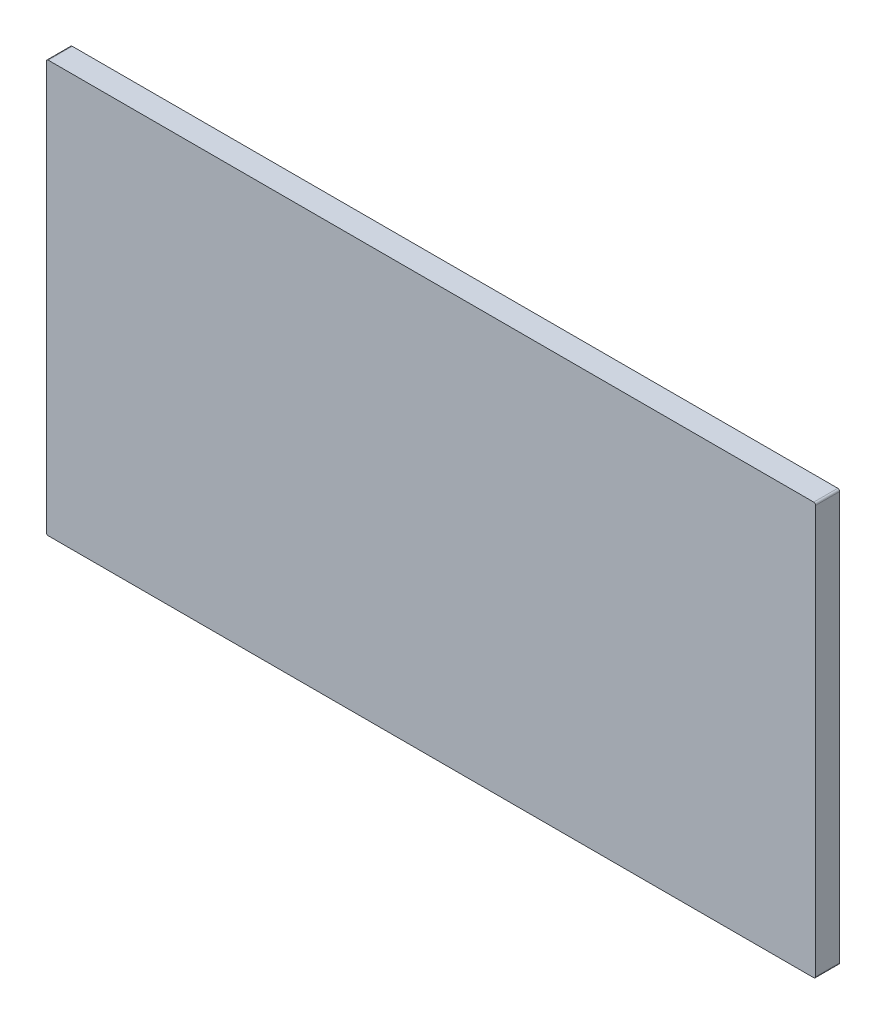
ISO-10303-21;
HEADER;
FILE_DESCRIPTION(('STEP AP214'),'2;1');
FILE_NAME('part.step','',(''),(''),'','','');
FILE_SCHEMA(('AUTOMOTIVE_DESIGN { 1 0 10303 214 1 1 1 1 }'));
ENDSEC;
DATA;
#1=APPLICATION_CONTEXT('core data for automotive mechanical design processes');
#2=APPLICATION_PROTOCOL_DEFINITION('international standard','automotive_design',2000,#1);
#3=PRODUCT_CONTEXT('',#1,'mechanical');
#4=PRODUCT('Part','Part','',(#3));
#5=PRODUCT_RELATED_PRODUCT_CATEGORY('part','',(#4));
#6=PRODUCT_DEFINITION_FORMATION('','',#4);
#7=PRODUCT_DEFINITION_CONTEXT('part definition',#1,'design');
#8=PRODUCT_DEFINITION('design','',#6,#7);
#9=PRODUCT_DEFINITION_SHAPE('','',#8);
#10=(LENGTH_UNIT() NAMED_UNIT(*) SI_UNIT(.MILLI.,.METRE.));
#11=(NAMED_UNIT(*) PLANE_ANGLE_UNIT() SI_UNIT($,.RADIAN.));
#12=(NAMED_UNIT(*) SI_UNIT($,.STERADIAN.) SOLID_ANGLE_UNIT());
#13=UNCERTAINTY_MEASURE_WITH_UNIT(LENGTH_MEASURE(1.E-05),#10,'distance_accuracy_value','');
#14=(GEOMETRIC_REPRESENTATION_CONTEXT(3) GLOBAL_UNCERTAINTY_ASSIGNED_CONTEXT((#13)) GLOBAL_UNIT_ASSIGNED_CONTEXT((#10,
#11,#12)) REPRESENTATION_CONTEXT('',''));
#15=CARTESIAN_POINT('',(0.,0.,0.));
#16=DIRECTION('',(0.,0.,1.));
#17=DIRECTION('',(1.,0.,0.));
#18=AXIS2_PLACEMENT_3D('',#15,#16,#17);
#19=CARTESIAN_POINT('',(-304.8,-163.195,9.525));
#20=DIRECTION('',(1.,0.,0.));
#21=DIRECTION('',(0.,0.,-1.));
#22=AXIS2_PLACEMENT_3D('',#19,#20,#21);
#23=PLANE('',#22);
#24=DIRECTION('',(0.,-1.,0.));
#25=VECTOR('',#24,1.);
#26=CARTESIAN_POINT('',(-304.8,-163.195,-9.525));
#27=LINE('',#26,#25);
#28=CARTESIAN_POINT('',(-304.8,161.695,-9.525));
#29=VERTEX_POINT('',#28);
#30=CARTESIAN_POINT('',(-304.8,-161.695,-9.525));
#31=VERTEX_POINT('',#30);
#32=EDGE_CURVE('E126',#29,#31,#27,.T.);
#33=ORIENTED_EDGE('',*,*,#32,.T.);
#34=DIRECTION('',(0.,0.,-1.));
#35=VECTOR('',#34,1.);
#36=CARTESIAN_POINT('',(-304.8,-161.695,9.525));
#37=LINE('',#36,#35);
#38=CARTESIAN_POINT('',(-304.8,-161.695,9.525));
#39=VERTEX_POINT('',#38);
#40=EDGE_CURVE('E104',#31,#39,#37,.F.);
#41=ORIENTED_EDGE('',*,*,#40,.T.);
#42=DIRECTION('',(0.,-1.,0.));
#43=VECTOR('',#42,1.);
#44=CARTESIAN_POINT('',(-304.8,-163.195,9.525));
#45=LINE('',#44,#43);
#46=CARTESIAN_POINT('',(-304.8,161.695,9.525));
#47=VERTEX_POINT('',#46);
#48=EDGE_CURVE('E135',#47,#39,#45,.T.);
#49=ORIENTED_EDGE('',*,*,#48,.F.);
#50=DIRECTION('',(0.,0.,-1.));
#51=VECTOR('',#50,1.);
#52=CARTESIAN_POINT('',(-304.8,161.695,9.525));
#53=LINE('',#52,#51);
#54=EDGE_CURVE('E109',#47,#29,#53,.T.);
#55=ORIENTED_EDGE('',*,*,#54,.T.);
#56=EDGE_LOOP('',(#33,#41,#49,#55));
#57=FACE_BOUND('',#56,.T.);
#58=ADVANCED_FACE('F33',(#57),#23,.F.);
#59=CARTESIAN_POINT('',(304.8,-163.195,9.525));
#60=DIRECTION('',(0.,1.,0.));
#61=DIRECTION('',(-1.,0.,0.));
#62=AXIS2_PLACEMENT_3D('',#59,#60,#61);
#63=PLANE('',#62);
#64=DIRECTION('',(1.,0.,0.));
#65=VECTOR('',#64,1.);
#66=CARTESIAN_POINT('',(304.8,-163.195,9.525));
#67=LINE('',#66,#65);
#68=CARTESIAN_POINT('',(-303.3,-163.195,9.525));
#69=VERTEX_POINT('',#68);
#70=CARTESIAN_POINT('',(303.3,-163.195,9.525));
#71=VERTEX_POINT('',#70);
#72=EDGE_CURVE('E119',#69,#71,#67,.T.);
#73=ORIENTED_EDGE('',*,*,#72,.F.);
#74=DIRECTION('',(0.,0.,-1.));
#75=VECTOR('',#74,1.);
#76=CARTESIAN_POINT('',(-303.3,-163.195,9.525));
#77=LINE('',#76,#75);
#78=CARTESIAN_POINT('',(-303.3,-163.195,-9.525));
#79=VERTEX_POINT('',#78);
#80=EDGE_CURVE('E103',#69,#79,#77,.T.);
#81=ORIENTED_EDGE('',*,*,#80,.T.);
#82=DIRECTION('',(1.,0.,0.));
#83=VECTOR('',#82,1.);
#84=CARTESIAN_POINT('',(304.8,-163.195,-9.525));
#85=LINE('',#84,#83);
#86=CARTESIAN_POINT('',(303.3,-163.195,-9.525));
#87=VERTEX_POINT('',#86);
#88=EDGE_CURVE('E116',#79,#87,#85,.T.);
#89=ORIENTED_EDGE('',*,*,#88,.T.);
#90=DIRECTION('',(0.,0.,-1.));
#91=VECTOR('',#90,1.);
#92=CARTESIAN_POINT('',(303.3,-163.195,9.525));
#93=LINE('',#92,#91);
#94=EDGE_CURVE('E121',#87,#71,#93,.F.);
#95=ORIENTED_EDGE('',*,*,#94,.T.);
#96=EDGE_LOOP('',(#73,#81,#89,#95));
#97=FACE_BOUND('',#96,.T.);
#98=ADVANCED_FACE('F115',(#97),#63,.F.);
#99=CARTESIAN_POINT('',(304.8,-163.195,9.525));
#100=DIRECTION('',(-1.,0.,0.));
#101=DIRECTION('',(0.,0.,1.));
#102=AXIS2_PLACEMENT_3D('',#99,#100,#101);
#103=PLANE('',#102);
#104=DIRECTION('',(0.,1.,0.));
#105=VECTOR('',#104,1.);
#106=CARTESIAN_POINT('',(304.8,-163.195,9.525));
#107=LINE('',#106,#105);
#108=CARTESIAN_POINT('',(304.8,-161.695,9.525));
#109=VERTEX_POINT('',#108);
#110=CARTESIAN_POINT('',(304.8,161.695,9.525));
#111=VERTEX_POINT('',#110);
#112=EDGE_CURVE('E161',#109,#111,#107,.T.);
#113=ORIENTED_EDGE('',*,*,#112,.F.);
#114=DIRECTION('',(0.,0.,-1.));
#115=VECTOR('',#114,1.);
#116=CARTESIAN_POINT('',(304.8,-161.695,9.525));
#117=LINE('',#116,#115);
#118=CARTESIAN_POINT('',(304.8,-161.695,-9.525));
#119=VERTEX_POINT('',#118);
#120=EDGE_CURVE('E154',#109,#119,#117,.T.);
#121=ORIENTED_EDGE('',*,*,#120,.T.);
#122=DIRECTION('',(0.,1.,0.));
#123=VECTOR('',#122,1.);
#124=CARTESIAN_POINT('',(304.8,-163.195,-9.525));
#125=LINE('',#124,#123);
#126=CARTESIAN_POINT('',(304.8,161.695,-9.525));
#127=VERTEX_POINT('',#126);
#128=EDGE_CURVE('E125',#119,#127,#125,.T.);
#129=ORIENTED_EDGE('',*,*,#128,.T.);
#130=DIRECTION('',(0.,0.,-1.));
#131=VECTOR('',#130,1.);
#132=CARTESIAN_POINT('',(304.8,161.695,9.525));
#133=LINE('',#132,#131);
#134=EDGE_CURVE('E152',#127,#111,#133,.F.);
#135=ORIENTED_EDGE('',*,*,#134,.T.);
#136=EDGE_LOOP('',(#113,#121,#129,#135));
#137=FACE_BOUND('',#136,.T.);
#138=ADVANCED_FACE('F159',(#137),#103,.F.);
#139=CARTESIAN_POINT('',(304.8,163.195,9.525));
#140=DIRECTION('',(0.,-1.,0.));
#141=DIRECTION('',(1.,0.,0.));
#142=AXIS2_PLACEMENT_3D('',#139,#140,#141);
#143=PLANE('',#142);
#144=DIRECTION('',(-1.,0.,0.));
#145=VECTOR('',#144,1.);
#146=CARTESIAN_POINT('',(304.8,163.195,9.525));
#147=LINE('',#146,#145);
#148=CARTESIAN_POINT('',(303.3,163.195,9.525));
#149=VERTEX_POINT('',#148);
#150=CARTESIAN_POINT('',(-303.3,163.195,9.525));
#151=VERTEX_POINT('',#150);
#152=EDGE_CURVE('E136',#149,#151,#147,.T.);
#153=ORIENTED_EDGE('',*,*,#152,.F.);
#154=DIRECTION('',(0.,0.,-1.));
#155=VECTOR('',#154,1.);
#156=CARTESIAN_POINT('',(303.3,163.195,9.525));
#157=LINE('',#156,#155);
#158=CARTESIAN_POINT('',(303.3,163.195,-9.525));
#159=VERTEX_POINT('',#158);
#160=EDGE_CURVE('E11',#149,#159,#157,.T.);
#161=ORIENTED_EDGE('',*,*,#160,.T.);
#162=DIRECTION('',(-1.,0.,0.));
#163=VECTOR('',#162,1.);
#164=CARTESIAN_POINT('',(304.8,163.195,-9.525));
#165=LINE('',#164,#163);
#166=CARTESIAN_POINT('',(-303.3,163.195,-9.525));
#167=VERTEX_POINT('',#166);
#168=EDGE_CURVE('E129',#159,#167,#165,.T.);
#169=ORIENTED_EDGE('',*,*,#168,.T.);
#170=DIRECTION('',(0.,0.,-1.));
#171=VECTOR('',#170,1.);
#172=CARTESIAN_POINT('',(-303.3,163.195,9.525));
#173=LINE('',#172,#171);
#174=EDGE_CURVE('E41',#167,#151,#173,.F.);
#175=ORIENTED_EDGE('',*,*,#174,.T.);
#176=EDGE_LOOP('',(#153,#161,#169,#175));
#177=FACE_BOUND('',#176,.T.);
#178=ADVANCED_FACE('F168',(#177),#143,.F.);
#179=CARTESIAN_POINT('',(0.,0.,9.525));
#180=DIRECTION('',(0.,0.,1.));
#181=DIRECTION('',(1.,0.,0.));
#182=AXIS2_PLACEMENT_3D('',#179,#180,#181);
#183=PLANE('',#182);
#184=ORIENTED_EDGE('',*,*,#48,.T.);
#185=CARTESIAN_POINT('',(-303.3,-161.695,9.525));
#186=DIRECTION('',(0.,0.,1.));
#187=DIRECTION('',(1.,0.,0.));
#188=AXIS2_PLACEMENT_3D('',#185,#186,#187);
#189=CIRCLE('',#188,1.5);
#190=EDGE_CURVE('E150',#39,#69,#189,.T.);
#191=ORIENTED_EDGE('',*,*,#190,.T.);
#192=ORIENTED_EDGE('',*,*,#72,.T.);
#193=CARTESIAN_POINT('',(303.3,-161.695,9.525));
#194=DIRECTION('',(0.,0.,1.));
#195=DIRECTION('',(1.,0.,0.));
#196=AXIS2_PLACEMENT_3D('',#193,#194,#195);
#197=CIRCLE('',#196,1.5);
#198=EDGE_CURVE('E148',#71,#109,#197,.T.);
#199=ORIENTED_EDGE('',*,*,#198,.T.);
#200=ORIENTED_EDGE('',*,*,#112,.T.);
#201=CARTESIAN_POINT('',(303.3,161.695,9.525));
#202=DIRECTION('',(0.,0.,1.));
#203=DIRECTION('',(1.,0.,0.));
#204=AXIS2_PLACEMENT_3D('',#201,#202,#203);
#205=CIRCLE('',#204,1.5);
#206=EDGE_CURVE('E54',#111,#149,#205,.T.);
#207=ORIENTED_EDGE('',*,*,#206,.T.);
#208=ORIENTED_EDGE('',*,*,#152,.T.);
#209=CARTESIAN_POINT('',(-303.3,161.695,9.525));
#210=DIRECTION('',(0.,0.,1.));
#211=DIRECTION('',(1.,0.,0.));
#212=AXIS2_PLACEMENT_3D('',#209,#210,#211);
#213=CIRCLE('',#212,1.5);
#214=EDGE_CURVE('E145',#151,#47,#213,.T.);
#215=ORIENTED_EDGE('',*,*,#214,.T.);
#216=EDGE_LOOP('',(#184,#191,#192,#199,#200,#207,#208,#215));
#217=FACE_BOUND('',#216,.T.);
#218=ADVANCED_FACE('F175',(#217),#183,.T.);
#219=CARTESIAN_POINT('',(0.,0.,-9.525));
#220=DIRECTION('',(0.,0.,1.));
#221=DIRECTION('',(1.,0.,0.));
#222=AXIS2_PLACEMENT_3D('',#219,#220,#221);
#223=PLANE('',#222);
#224=ORIENTED_EDGE('',*,*,#88,.F.);
#225=CARTESIAN_POINT('',(-303.3,-161.695,-9.525));
#226=DIRECTION('',(0.,0.,1.));
#227=DIRECTION('',(1.,0.,0.));
#228=AXIS2_PLACEMENT_3D('',#225,#226,#227);
#229=CIRCLE('',#228,1.5);
#230=EDGE_CURVE('E99',#79,#31,#229,.F.);
#231=ORIENTED_EDGE('',*,*,#230,.T.);
#232=ORIENTED_EDGE('',*,*,#32,.F.);
#233=CARTESIAN_POINT('',(-303.3,161.695,-9.525));
#234=DIRECTION('',(0.,0.,1.));
#235=DIRECTION('',(1.,0.,0.));
#236=AXIS2_PLACEMENT_3D('',#233,#234,#235);
#237=CIRCLE('',#236,1.5);
#238=EDGE_CURVE('E120',#29,#167,#237,.F.);
#239=ORIENTED_EDGE('',*,*,#238,.T.);
#240=ORIENTED_EDGE('',*,*,#168,.F.);
#241=CARTESIAN_POINT('',(303.3,161.695,-9.525));
#242=DIRECTION('',(0.,0.,1.));
#243=DIRECTION('',(1.,0.,0.));
#244=AXIS2_PLACEMENT_3D('',#241,#242,#243);
#245=CIRCLE('',#244,1.5);
#246=EDGE_CURVE('E139',#159,#127,#245,.F.);
#247=ORIENTED_EDGE('',*,*,#246,.T.);
#248=ORIENTED_EDGE('',*,*,#128,.F.);
#249=CARTESIAN_POINT('',(303.3,-161.695,-9.525));
#250=DIRECTION('',(0.,0.,1.));
#251=DIRECTION('',(1.,0.,0.));
#252=AXIS2_PLACEMENT_3D('',#249,#250,#251);
#253=CIRCLE('',#252,1.5);
#254=EDGE_CURVE('E110',#119,#87,#253,.F.);
#255=ORIENTED_EDGE('',*,*,#254,.T.);
#256=EDGE_LOOP('',(#224,#231,#232,#239,#240,#247,#248,#255));
#257=FACE_BOUND('',#256,.T.);
#258=ADVANCED_FACE('F123',(#257),#223,.F.);
#259=CARTESIAN_POINT('',(-303.3,-161.695,9.525));
#260=DIRECTION('',(0.,0.,-1.));
#261=DIRECTION('',(-1.,0.,0.));
#262=AXIS2_PLACEMENT_3D('',#259,#260,#261);
#263=CYLINDRICAL_SURFACE('',#262,1.5);
#264=ORIENTED_EDGE('',*,*,#190,.F.);
#265=ORIENTED_EDGE('',*,*,#40,.F.);
#266=ORIENTED_EDGE('',*,*,#230,.F.);
#267=ORIENTED_EDGE('',*,*,#80,.F.);
#268=EDGE_LOOP('',(#264,#265,#266,#267));
#269=FACE_BOUND('',#268,.T.);
#270=ADVANCED_FACE('F102',(#269),#263,.T.);
#271=CARTESIAN_POINT('',(303.3,-161.695,9.525));
#272=DIRECTION('',(0.,0.,-1.));
#273=DIRECTION('',(-1.,0.,0.));
#274=AXIS2_PLACEMENT_3D('',#271,#272,#273);
#275=CYLINDRICAL_SURFACE('',#274,1.5);
#276=ORIENTED_EDGE('',*,*,#198,.F.);
#277=ORIENTED_EDGE('',*,*,#94,.F.);
#278=ORIENTED_EDGE('',*,*,#254,.F.);
#279=ORIENTED_EDGE('',*,*,#120,.F.);
#280=EDGE_LOOP('',(#276,#277,#278,#279));
#281=FACE_BOUND('',#280,.T.);
#282=ADVANCED_FACE('F183',(#281),#275,.T.);
#283=CARTESIAN_POINT('',(303.3,161.695,9.525));
#284=DIRECTION('',(0.,0.,-1.));
#285=DIRECTION('',(-1.,0.,0.));
#286=AXIS2_PLACEMENT_3D('',#283,#284,#285);
#287=CYLINDRICAL_SURFACE('',#286,1.5);
#288=ORIENTED_EDGE('',*,*,#206,.F.);
#289=ORIENTED_EDGE('',*,*,#134,.F.);
#290=ORIENTED_EDGE('',*,*,#246,.F.);
#291=ORIENTED_EDGE('',*,*,#160,.F.);
#292=EDGE_LOOP('',(#288,#289,#290,#291));
#293=FACE_BOUND('',#292,.T.);
#294=ADVANCED_FACE('F167',(#293),#287,.T.);
#295=CARTESIAN_POINT('',(-303.3,161.695,9.525));
#296=DIRECTION('',(0.,0.,-1.));
#297=DIRECTION('',(-1.,0.,0.));
#298=AXIS2_PLACEMENT_3D('',#295,#296,#297);
#299=CYLINDRICAL_SURFACE('',#298,1.5);
#300=ORIENTED_EDGE('',*,*,#214,.F.);
#301=ORIENTED_EDGE('',*,*,#174,.F.);
#302=ORIENTED_EDGE('',*,*,#238,.F.);
#303=ORIENTED_EDGE('',*,*,#54,.F.);
#304=EDGE_LOOP('',(#300,#301,#302,#303));
#305=FACE_BOUND('',#304,.T.);
#306=ADVANCED_FACE('F35',(#305),#299,.T.);
#307=CLOSED_SHELL('',(#58,#98,#138,#178,#218,#258,#270,#282,#294,#306));
#308=MANIFOLD_SOLID_BREP('B2',#307);
#309=ADVANCED_BREP_SHAPE_REPRESENTATION('',(#18,#308),#14);
#310=SHAPE_DEFINITION_REPRESENTATION(#9,#309);
ENDSEC;
END-ISO-10303-21;
